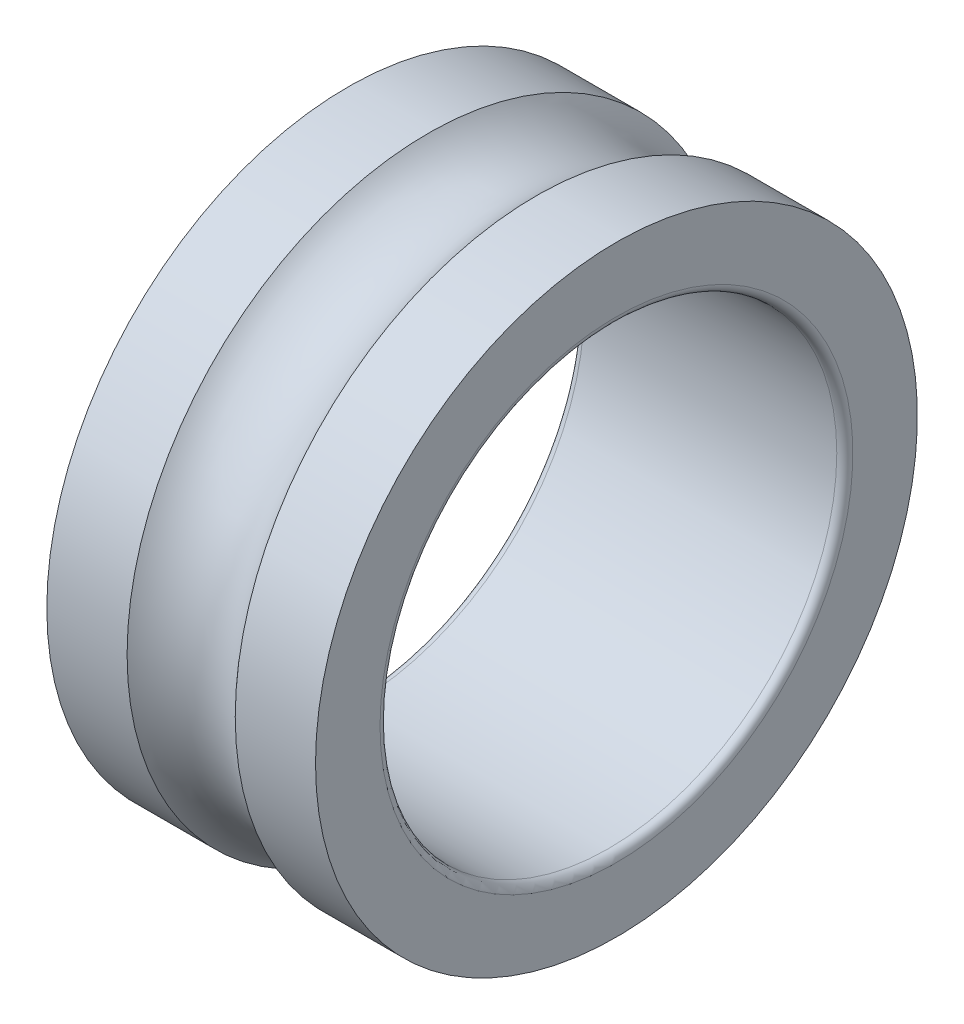
ISO-10303-21;
HEADER;
FILE_DESCRIPTION(('STEP AP214'),'2;1');
FILE_NAME('part.step','',(''),(''),'','','');
FILE_SCHEMA(('AUTOMOTIVE_DESIGN { 1 0 10303 214 1 1 1 1 }'));
ENDSEC;
DATA;
#1=APPLICATION_CONTEXT('core data for automotive mechanical design processes');
#2=APPLICATION_PROTOCOL_DEFINITION('international standard','automotive_design',2000,#1);
#3=PRODUCT_CONTEXT('',#1,'mechanical');
#4=PRODUCT('Part','Part','',(#3));
#5=PRODUCT_RELATED_PRODUCT_CATEGORY('part','',(#4));
#6=PRODUCT_DEFINITION_FORMATION('','',#4);
#7=PRODUCT_DEFINITION_CONTEXT('part definition',#1,'design');
#8=PRODUCT_DEFINITION('design','',#6,#7);
#9=PRODUCT_DEFINITION_SHAPE('','',#8);
#10=(LENGTH_UNIT() NAMED_UNIT(*) SI_UNIT(.MILLI.,.METRE.));
#11=(NAMED_UNIT(*) PLANE_ANGLE_UNIT() SI_UNIT($,.RADIAN.));
#12=(NAMED_UNIT(*) SI_UNIT($,.STERADIAN.) SOLID_ANGLE_UNIT());
#13=UNCERTAINTY_MEASURE_WITH_UNIT(LENGTH_MEASURE(1.E-05),#10,'distance_accuracy_value','');
#14=(GEOMETRIC_REPRESENTATION_CONTEXT(3) GLOBAL_UNCERTAINTY_ASSIGNED_CONTEXT((#13)) GLOBAL_UNIT_ASSIGNED_CONTEXT((#10,
#11,#12)) REPRESENTATION_CONTEXT('',''));
#15=CARTESIAN_POINT('',(0.,0.,0.));
#16=DIRECTION('',(0.,0.,1.));
#17=DIRECTION('',(1.,0.,0.));
#18=AXIS2_PLACEMENT_3D('',#15,#16,#17);
#19=CARTESIAN_POINT('',(0.300000000000001,0.,0.));
#20=DIRECTION('',(-1.,0.,0.));
#21=DIRECTION('',(0.,0.,1.));
#22=AXIS2_PLACEMENT_3D('',#19,#20,#21);
#23=TOROIDAL_SURFACE('',#22,8.8,0.3);
#24=CARTESIAN_POINT('',(0.300000000000001,0.,0.));
#25=DIRECTION('',(-1.,0.,0.));
#26=DIRECTION('',(0.,0.,1.));
#27=AXIS2_PLACEMENT_3D('',#24,#25,#26);
#28=CIRCLE('',#27,8.5);
#29=CARTESIAN_POINT('',(0.300000000000001,0.,8.5));
#30=VERTEX_POINT('',#29);
#31=EDGE_CURVE('E10',#30,#30,#28,.T.);
#32=ORIENTED_EDGE('',*,*,#31,.F.);
#33=EDGE_LOOP('',(#32));
#34=FACE_BOUND('',#33,.T.);
#35=CARTESIAN_POINT('',(0.,0.,0.));
#36=DIRECTION('',(-1.,0.,0.));
#37=DIRECTION('',(0.,0.,1.));
#38=AXIS2_PLACEMENT_3D('',#35,#36,#37);
#39=CIRCLE('',#38,8.8);
#40=CARTESIAN_POINT('',(0.,0.,8.8));
#41=VERTEX_POINT('',#40);
#42=EDGE_CURVE('E57',#41,#41,#39,.T.);
#43=ORIENTED_EDGE('',*,*,#42,.T.);
#44=EDGE_LOOP('',(#43));
#45=FACE_BOUND('',#44,.T.);
#46=ADVANCED_FACE('F29',(#34,#45),#23,.T.);
#47=CARTESIAN_POINT('',(0.,0.,0.));
#48=DIRECTION('',(-1.,0.,0.));
#49=DIRECTION('',(0.,0.,1.));
#50=AXIS2_PLACEMENT_3D('',#47,#48,#49);
#51=CYLINDRICAL_SURFACE('',#50,8.5);
#52=CARTESIAN_POINT('',(9.7,0.,0.));
#53=DIRECTION('',(-1.,0.,0.));
#54=DIRECTION('',(0.,0.,1.));
#55=AXIS2_PLACEMENT_3D('',#52,#53,#54);
#56=CIRCLE('',#55,8.5);
#57=CARTESIAN_POINT('',(9.7,0.,8.5));
#58=VERTEX_POINT('',#57);
#59=EDGE_CURVE('E35',#58,#58,#56,.T.);
#60=ORIENTED_EDGE('',*,*,#59,.F.);
#61=EDGE_LOOP('',(#60));
#62=FACE_BOUND('',#61,.T.);
#63=ORIENTED_EDGE('',*,*,#31,.T.);
#64=EDGE_LOOP('',(#63));
#65=FACE_BOUND('',#64,.T.);
#66=ADVANCED_FACE('F94',(#62,#65),#51,.F.);
#67=CARTESIAN_POINT('',(9.7,0.,0.));
#68=DIRECTION('',(-1.,0.,0.));
#69=DIRECTION('',(0.,0.,1.));
#70=AXIS2_PLACEMENT_3D('',#67,#68,#69);
#71=TOROIDAL_SURFACE('',#70,8.8,0.300000000000002);
#72=CARTESIAN_POINT('',(10.,0.,0.));
#73=DIRECTION('',(-1.,0.,0.));
#74=DIRECTION('',(0.,0.,1.));
#75=AXIS2_PLACEMENT_3D('',#72,#73,#74);
#76=CIRCLE('',#75,8.8);
#77=CARTESIAN_POINT('',(10.,0.,8.8));
#78=VERTEX_POINT('',#77);
#79=EDGE_CURVE('E39',#78,#78,#76,.T.);
#80=ORIENTED_EDGE('',*,*,#79,.F.);
#81=EDGE_LOOP('',(#80));
#82=FACE_BOUND('',#81,.T.);
#83=ORIENTED_EDGE('',*,*,#59,.T.);
#84=EDGE_LOOP('',(#83));
#85=FACE_BOUND('',#84,.T.);
#86=ADVANCED_FACE('F89',(#82,#85),#71,.T.);
#87=CARTESIAN_POINT('',(10.,0.,-11.2));
#88=DIRECTION('',(-1.,0.,0.));
#89=DIRECTION('',(0.,0.,1.));
#90=AXIS2_PLACEMENT_3D('',#87,#88,#89);
#91=PLANE('',#90);
#92=CARTESIAN_POINT('',(10.,0.,0.));
#93=DIRECTION('',(-1.,0.,0.));
#94=DIRECTION('',(0.,0.,1.));
#95=AXIS2_PLACEMENT_3D('',#92,#93,#94);
#96=CIRCLE('',#95,11.2);
#97=CARTESIAN_POINT('',(10.,0.,11.2));
#98=VERTEX_POINT('',#97);
#99=EDGE_CURVE('E43',#98,#98,#96,.T.);
#100=ORIENTED_EDGE('',*,*,#99,.F.);
#101=EDGE_LOOP('',(#100));
#102=FACE_BOUND('',#101,.T.);
#103=ORIENTED_EDGE('',*,*,#79,.T.);
#104=EDGE_LOOP('',(#103));
#105=FACE_BOUND('',#104,.T.);
#106=ADVANCED_FACE('F83',(#102,#105),#91,.F.);
#107=CARTESIAN_POINT('',(0.,0.,0.));
#108=DIRECTION('',(-1.,0.,0.));
#109=DIRECTION('',(0.,0.,1.));
#110=AXIS2_PLACEMENT_3D('',#107,#108,#109);
#111=CYLINDRICAL_SURFACE('',#110,11.2);
#112=CARTESIAN_POINT('',(7.01246117974981,0.,0.));
#113=DIRECTION('',(-1.,0.,0.));
#114=DIRECTION('',(0.,0.,1.));
#115=AXIS2_PLACEMENT_3D('',#112,#113,#114);
#116=CIRCLE('',#115,11.2);
#117=CARTESIAN_POINT('',(7.01246117974981,0.,11.2));
#118=VERTEX_POINT('',#117);
#119=EDGE_CURVE('E48',#118,#118,#116,.T.);
#120=ORIENTED_EDGE('',*,*,#119,.F.);
#121=EDGE_LOOP('',(#120));
#122=FACE_BOUND('',#121,.T.);
#123=ORIENTED_EDGE('',*,*,#99,.T.);
#124=EDGE_LOOP('',(#123));
#125=FACE_BOUND('',#124,.T.);
#126=ADVANCED_FACE('F77',(#122,#125),#111,.T.);
#127=CARTESIAN_POINT('',(5.,0.,0.));
#128=DIRECTION('',(-1.,0.,0.));
#129=DIRECTION('',(0.,0.,1.));
#130=AXIS2_PLACEMENT_3D('',#127,#128,#129);
#131=TOROIDAL_SURFACE('',#130,13.,2.7);
#132=CARTESIAN_POINT('',(2.98753882025019,0.,0.));
#133=DIRECTION('',(-1.,0.,0.));
#134=DIRECTION('',(0.,0.,1.));
#135=AXIS2_PLACEMENT_3D('',#132,#133,#134);
#136=CIRCLE('',#135,11.2);
#137=CARTESIAN_POINT('',(2.98753882025019,0.,11.2));
#138=VERTEX_POINT('',#137);
#139=EDGE_CURVE('E51',#138,#138,#136,.T.);
#140=ORIENTED_EDGE('',*,*,#139,.F.);
#141=EDGE_LOOP('',(#140));
#142=FACE_BOUND('',#141,.T.);
#143=ORIENTED_EDGE('',*,*,#119,.T.);
#144=EDGE_LOOP('',(#143));
#145=FACE_BOUND('',#144,.T.);
#146=ADVANCED_FACE('F71',(#142,#145),#131,.F.);
#147=CARTESIAN_POINT('',(0.,0.,0.));
#148=DIRECTION('',(-1.,0.,0.));
#149=DIRECTION('',(0.,0.,1.));
#150=AXIS2_PLACEMENT_3D('',#147,#148,#149);
#151=CYLINDRICAL_SURFACE('',#150,11.2);
#152=CARTESIAN_POINT('',(0.,0.,0.));
#153=DIRECTION('',(-1.,0.,0.));
#154=DIRECTION('',(0.,0.,1.));
#155=AXIS2_PLACEMENT_3D('',#152,#153,#154);
#156=CIRCLE('',#155,11.2);
#157=CARTESIAN_POINT('',(0.,0.,11.2));
#158=VERTEX_POINT('',#157);
#159=EDGE_CURVE('E54',#158,#158,#156,.T.);
#160=ORIENTED_EDGE('',*,*,#159,.F.);
#161=EDGE_LOOP('',(#160));
#162=FACE_BOUND('',#161,.T.);
#163=ORIENTED_EDGE('',*,*,#139,.T.);
#164=EDGE_LOOP('',(#163));
#165=FACE_BOUND('',#164,.T.);
#166=ADVANCED_FACE('F65',(#162,#165),#151,.T.);
#167=CARTESIAN_POINT('',(0.,0.,-11.2));
#168=DIRECTION('',(1.,0.,0.));
#169=DIRECTION('',(0.,0.,-1.));
#170=AXIS2_PLACEMENT_3D('',#167,#168,#169);
#171=PLANE('',#170);
#172=ORIENTED_EDGE('',*,*,#42,.F.);
#173=EDGE_LOOP('',(#172));
#174=FACE_BOUND('',#173,.T.);
#175=ORIENTED_EDGE('',*,*,#159,.T.);
#176=EDGE_LOOP('',(#175));
#177=FACE_BOUND('',#176,.T.);
#178=ADVANCED_FACE('F62',(#174,#177),#171,.F.);
#179=CLOSED_SHELL('',(#46,#66,#86,#106,#126,#146,#166,#178));
#180=MANIFOLD_SOLID_BREP('B2',#179);
#181=ADVANCED_BREP_SHAPE_REPRESENTATION('',(#18,#180),#14);
#182=SHAPE_DEFINITION_REPRESENTATION(#9,#181);
ENDSEC;
END-ISO-10303-21;
